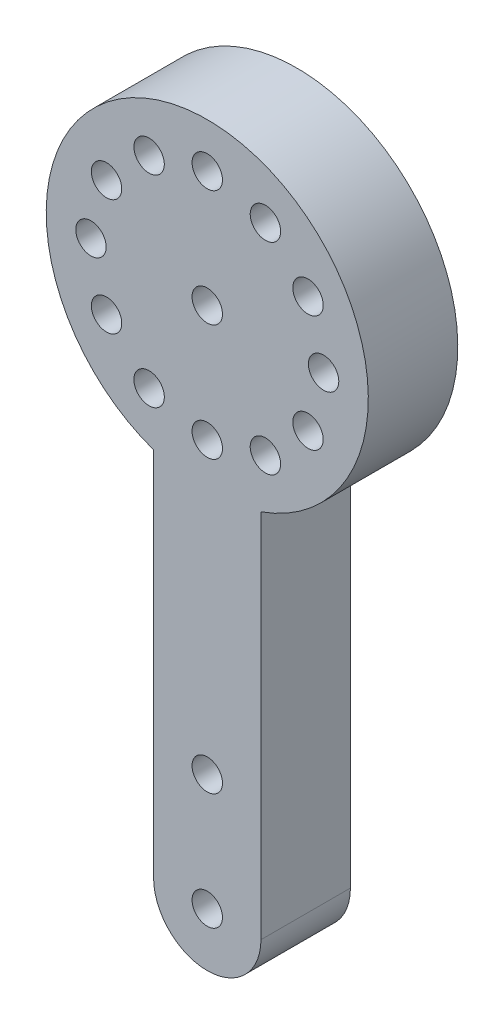
ISO-10303-21;
HEADER;
FILE_DESCRIPTION(('STEP AP214'),'2;1');
FILE_NAME('part.step','',(''),(''),'','','');
FILE_SCHEMA(('AUTOMOTIVE_DESIGN { 1 0 10303 214 1 1 1 1 }'));
ENDSEC;
DATA;
#1=APPLICATION_CONTEXT('core data for automotive mechanical design processes');
#2=APPLICATION_PROTOCOL_DEFINITION('international standard','automotive_design',2000,#1);
#3=PRODUCT_CONTEXT('',#1,'mechanical');
#4=PRODUCT('Part','Part','',(#3));
#5=PRODUCT_RELATED_PRODUCT_CATEGORY('part','',(#4));
#6=PRODUCT_DEFINITION_FORMATION('','',#4);
#7=PRODUCT_DEFINITION_CONTEXT('part definition',#1,'design');
#8=PRODUCT_DEFINITION('design','',#6,#7);
#9=PRODUCT_DEFINITION_SHAPE('','',#8);
#10=(LENGTH_UNIT() NAMED_UNIT(*) SI_UNIT(.MILLI.,.METRE.));
#11=(NAMED_UNIT(*) PLANE_ANGLE_UNIT() SI_UNIT($,.RADIAN.));
#12=(NAMED_UNIT(*) SI_UNIT($,.STERADIAN.) SOLID_ANGLE_UNIT());
#13=UNCERTAINTY_MEASURE_WITH_UNIT(LENGTH_MEASURE(1.E-05),#10,'distance_accuracy_value','');
#14=(GEOMETRIC_REPRESENTATION_CONTEXT(3) GLOBAL_UNCERTAINTY_ASSIGNED_CONTEXT((#13)) GLOBAL_UNIT_ASSIGNED_CONTEXT((#10,
#11,#12)) REPRESENTATION_CONTEXT('',''));
#15=CARTESIAN_POINT('',(0.,0.,0.));
#16=DIRECTION('',(0.,0.,1.));
#17=DIRECTION('',(1.,0.,0.));
#18=AXIS2_PLACEMENT_3D('',#15,#16,#17);
#19=CARTESIAN_POINT('',(0.,0.,5.));
#20=DIRECTION('',(0.,0.,1.));
#21=DIRECTION('',(1.,0.,0.));
#22=AXIS2_PLACEMENT_3D('',#19,#20,#21);
#23=PLANE('',#22);
#24=CARTESIAN_POINT('',(11.2583302491977,51.8878305422792,5.));
#25=DIRECTION('',(0.,0.,1.));
#26=DIRECTION('',(1.,0.,0.));
#27=AXIS2_PLACEMENT_3D('',#24,#25,#26);
#28=CIRCLE('',#27,1.7);
#29=CARTESIAN_POINT('',(12.9583302491977,51.8878305422792,5.));
#30=VERTEX_POINT('',#29);
#31=EDGE_CURVE('E193',#30,#30,#28,.T.);
#32=ORIENTED_EDGE('',*,*,#31,.F.);
#33=EDGE_LOOP('',(#32));
#34=FACE_BOUND('',#33,.T.);
#35=CARTESIAN_POINT('',(11.2583302491977,64.8878305422792,5.));
#36=DIRECTION('',(0.,0.,1.));
#37=DIRECTION('',(1.,0.,0.));
#38=AXIS2_PLACEMENT_3D('',#35,#36,#37);
#39=CIRCLE('',#38,1.70000000000001);
#40=CARTESIAN_POINT('',(12.9583302491977,64.8878305422792,5.));
#41=VERTEX_POINT('',#40);
#42=EDGE_CURVE('E181',#41,#41,#39,.T.);
#43=ORIENTED_EDGE('',*,*,#42,.F.);
#44=EDGE_LOOP('',(#43));
#45=FACE_BOUND('',#44,.T.);
#46=CARTESIAN_POINT('',(0.,71.3878305422792,5.));
#47=DIRECTION('',(0.,0.,1.));
#48=DIRECTION('',(1.,0.,0.));
#49=AXIS2_PLACEMENT_3D('',#46,#47,#48);
#50=CIRCLE('',#49,1.70000000000001);
#51=CARTESIAN_POINT('',(1.70000000000001,71.3878305422792,5.));
#52=VERTEX_POINT('',#51);
#53=EDGE_CURVE('E169',#52,#52,#50,.T.);
#54=ORIENTED_EDGE('',*,*,#53,.F.);
#55=EDGE_LOOP('',(#54));
#56=FACE_BOUND('',#55,.T.);
#57=CARTESIAN_POINT('',(-11.2583302491977,64.8878305422792,5.));
#58=DIRECTION('',(0.,0.,1.));
#59=DIRECTION('',(1.,0.,0.));
#60=AXIS2_PLACEMENT_3D('',#57,#58,#59);
#61=CIRCLE('',#60,1.70000000000001);
#62=CARTESIAN_POINT('',(-9.55833024919769,64.8878305422792,5.));
#63=VERTEX_POINT('',#62);
#64=EDGE_CURVE('E157',#63,#63,#61,.T.);
#65=ORIENTED_EDGE('',*,*,#64,.F.);
#66=EDGE_LOOP('',(#65));
#67=FACE_BOUND('',#66,.T.);
#68=CARTESIAN_POINT('',(-11.2583302491977,51.8878305422792,5.));
#69=DIRECTION('',(0.,0.,1.));
#70=DIRECTION('',(1.,0.,0.));
#71=AXIS2_PLACEMENT_3D('',#68,#69,#70);
#72=CIRCLE('',#71,1.7);
#73=CARTESIAN_POINT('',(-9.55833024919769,51.8878305422792,5.));
#74=VERTEX_POINT('',#73);
#75=EDGE_CURVE('E145',#74,#74,#72,.T.);
#76=ORIENTED_EDGE('',*,*,#75,.F.);
#77=EDGE_LOOP('',(#76));
#78=FACE_BOUND('',#77,.T.);
#79=CARTESIAN_POINT('',(0.,45.3878305422792,5.));
#80=DIRECTION('',(0.,0.,1.));
#81=DIRECTION('',(1.,0.,0.));
#82=AXIS2_PLACEMENT_3D('',#79,#80,#81);
#83=CIRCLE('',#82,1.7);
#84=CARTESIAN_POINT('',(1.7,45.3878305422792,5.));
#85=VERTEX_POINT('',#84);
#86=EDGE_CURVE('E133',#85,#85,#83,.T.);
#87=ORIENTED_EDGE('',*,*,#86,.F.);
#88=EDGE_LOOP('',(#87));
#89=FACE_BOUND('',#88,.T.);
#90=CARTESIAN_POINT('',(0.,0.,5.));
#91=DIRECTION('',(0.,0.,1.));
#92=DIRECTION('',(1.,0.,0.));
#93=AXIS2_PLACEMENT_3D('',#90,#91,#92);
#94=CIRCLE('',#93,1.7);
#95=CARTESIAN_POINT('',(1.7,0.,5.));
#96=VERTEX_POINT('',#95);
#97=EDGE_CURVE('E121',#96,#96,#94,.T.);
#98=ORIENTED_EDGE('',*,*,#97,.F.);
#99=EDGE_LOOP('',(#98));
#100=FACE_BOUND('',#99,.T.);
#101=CARTESIAN_POINT('',(0.,0.,5.));
#102=DIRECTION('',(0.,0.,1.));
#103=DIRECTION('',(1.,0.,0.));
#104=AXIS2_PLACEMENT_3D('',#101,#102,#103);
#105=CIRCLE('',#104,6.0000000000034);
#106=CARTESIAN_POINT('',(-5.99999999999651,9.244999036111E-06,5.));
#107=VERTEX_POINT('',#106);
#108=CARTESIAN_POINT('',(5.99999999999159,-1.17905613372308E-05,5.));
#109=VERTEX_POINT('',#108);
#110=EDGE_CURVE('E91',#107,#109,#105,.T.);
#111=ORIENTED_EDGE('',*,*,#110,.T.);
#112=DIRECTION('',(7.18269886068625E-07,0.999999999999742,0.));
#113=VECTOR('',#112,1.);
#114=CARTESIAN_POINT('',(5.99999999999159,-1.17905613372308E-05,5.));
#115=LINE('',#114,#113);
#116=CARTESIAN_POINT('',(6.00002974878383,41.4172783116145,5.));
#117=VERTEX_POINT('',#116);
#118=EDGE_CURVE('E86',#109,#117,#115,.T.);
#119=ORIENTED_EDGE('',*,*,#118,.T.);
#120=CARTESIAN_POINT('',(0.,58.3878305422792,5.));
#121=DIRECTION('',(0.,0.,1.));
#122=DIRECTION('',(1.,0.,0.));
#123=AXIS2_PLACEMENT_3D('',#120,#121,#122);
#124=CIRCLE('',#123,18.0000000000002);
#125=CARTESIAN_POINT('',(-5.99997025123423,41.4172572760541,5.));
#126=VERTEX_POINT('',#125);
#127=EDGE_CURVE('E89',#117,#126,#124,.T.);
#128=ORIENTED_EDGE('',*,*,#127,.T.);
#129=DIRECTION('',(-7.18269892172502E-07,-0.999999999999742,0.));
#130=VECTOR('',#129,1.);
#131=CARTESIAN_POINT('',(-5.99999999999651,9.244999036111E-06,5.));
#132=LINE('',#131,#130);
#133=EDGE_CURVE('E56',#126,#107,#132,.T.);
#134=ORIENTED_EDGE('',*,*,#133,.T.);
#135=EDGE_LOOP('',(#111,#119,#128,#134));
#136=FACE_BOUND('',#135,.T.);
#137=CARTESIAN_POINT('',(0.,58.3878305422792,5.));
#138=DIRECTION('',(0.,0.,1.));
#139=DIRECTION('',(1.,0.,0.));
#140=AXIS2_PLACEMENT_3D('',#137,#138,#139);
#141=CIRCLE('',#140,1.7);
#142=CARTESIAN_POINT('',(1.7,58.3878305422792,5.));
#143=VERTEX_POINT('',#142);
#144=EDGE_CURVE('E106',#143,#143,#141,.T.);
#145=ORIENTED_EDGE('',*,*,#144,.F.);
#146=EDGE_LOOP('',(#145));
#147=FACE_BOUND('',#146,.T.);
#148=CARTESIAN_POINT('',(0.,13.,5.));
#149=DIRECTION('',(0.,0.,1.));
#150=DIRECTION('',(1.,0.,0.));
#151=AXIS2_PLACEMENT_3D('',#148,#149,#150);
#152=CIRCLE('',#151,1.7);
#153=CARTESIAN_POINT('',(1.7,13.,5.));
#154=VERTEX_POINT('',#153);
#155=EDGE_CURVE('E127',#154,#154,#152,.T.);
#156=ORIENTED_EDGE('',*,*,#155,.F.);
#157=EDGE_LOOP('',(#156));
#158=FACE_BOUND('',#157,.T.);
#159=CARTESIAN_POINT('',(-6.5,47.1295002930815,5.));
#160=DIRECTION('',(0.,0.,1.));
#161=DIRECTION('',(1.,0.,0.));
#162=AXIS2_PLACEMENT_3D('',#159,#160,#161);
#163=CIRCLE('',#162,1.7);
#164=CARTESIAN_POINT('',(-4.8,47.1295002930815,5.));
#165=VERTEX_POINT('',#164);
#166=EDGE_CURVE('E139',#165,#165,#163,.T.);
#167=ORIENTED_EDGE('',*,*,#166,.F.);
#168=EDGE_LOOP('',(#167));
#169=FACE_BOUND('',#168,.T.);
#170=CARTESIAN_POINT('',(-13.,58.3878305422792,5.));
#171=DIRECTION('',(0.,0.,1.));
#172=DIRECTION('',(1.,0.,0.));
#173=AXIS2_PLACEMENT_3D('',#170,#171,#172);
#174=CIRCLE('',#173,1.7);
#175=CARTESIAN_POINT('',(-11.3,58.3878305422792,5.));
#176=VERTEX_POINT('',#175);
#177=EDGE_CURVE('E151',#176,#176,#174,.T.);
#178=ORIENTED_EDGE('',*,*,#177,.F.);
#179=EDGE_LOOP('',(#178));
#180=FACE_BOUND('',#179,.T.);
#181=CARTESIAN_POINT('',(-6.50000000000001,69.6461607914769,5.));
#182=DIRECTION('',(0.,0.,1.));
#183=DIRECTION('',(1.,0.,0.));
#184=AXIS2_PLACEMENT_3D('',#181,#182,#183);
#185=CIRCLE('',#184,1.70000000000001);
#186=CARTESIAN_POINT('',(-4.79999999999999,69.6461607914769,5.));
#187=VERTEX_POINT('',#186);
#188=EDGE_CURVE('E163',#187,#187,#185,.T.);
#189=ORIENTED_EDGE('',*,*,#188,.F.);
#190=EDGE_LOOP('',(#189));
#191=FACE_BOUND('',#190,.T.);
#192=CARTESIAN_POINT('',(6.5,69.6461607914769,5.));
#193=DIRECTION('',(0.,0.,1.));
#194=DIRECTION('',(1.,0.,0.));
#195=AXIS2_PLACEMENT_3D('',#192,#193,#194);
#196=CIRCLE('',#195,1.70000000000001);
#197=CARTESIAN_POINT('',(8.20000000000001,69.6461607914769,5.));
#198=VERTEX_POINT('',#197);
#199=EDGE_CURVE('E175',#198,#198,#196,.T.);
#200=ORIENTED_EDGE('',*,*,#199,.F.);
#201=EDGE_LOOP('',(#200));
#202=FACE_BOUND('',#201,.T.);
#203=CARTESIAN_POINT('',(13.,58.3878305422792,5.));
#204=DIRECTION('',(0.,0.,1.));
#205=DIRECTION('',(1.,0.,0.));
#206=AXIS2_PLACEMENT_3D('',#203,#204,#205);
#207=CIRCLE('',#206,1.7);
#208=CARTESIAN_POINT('',(14.7,58.3878305422792,5.));
#209=VERTEX_POINT('',#208);
#210=EDGE_CURVE('E187',#209,#209,#207,.T.);
#211=ORIENTED_EDGE('',*,*,#210,.F.);
#212=EDGE_LOOP('',(#211));
#213=FACE_BOUND('',#212,.T.);
#214=CARTESIAN_POINT('',(6.49999999999999,47.1295002930815,5.));
#215=DIRECTION('',(0.,0.,1.));
#216=DIRECTION('',(1.,0.,0.));
#217=AXIS2_PLACEMENT_3D('',#214,#215,#216);
#218=CIRCLE('',#217,1.7);
#219=CARTESIAN_POINT('',(8.19999999999999,47.1295002930815,5.));
#220=VERTEX_POINT('',#219);
#221=EDGE_CURVE('E199',#220,#220,#218,.T.);
#222=ORIENTED_EDGE('',*,*,#221,.F.);
#223=EDGE_LOOP('',(#222));
#224=FACE_BOUND('',#223,.T.);
#225=ADVANCED_FACE('F39',(#34,#45,#56,#67,#78,#89,#100,#136,#147,#158,#169,#180,#191,#202,#213,
#224),#23,.T.);
#226=CARTESIAN_POINT('',(0.,0.,-5.));
#227=DIRECTION('',(0.,0.,1.));
#228=DIRECTION('',(1.,0.,0.));
#229=AXIS2_PLACEMENT_3D('',#226,#227,#228);
#230=PLANE('',#229);
#231=CARTESIAN_POINT('',(0.,0.,-5.));
#232=DIRECTION('',(0.,0.,1.));
#233=DIRECTION('',(1.,0.,0.));
#234=AXIS2_PLACEMENT_3D('',#231,#232,#233);
#235=CIRCLE('',#234,6.0000000000034);
#236=CARTESIAN_POINT('',(-5.99999999999651,9.244999036111E-06,-5.));
#237=VERTEX_POINT('',#236);
#238=CARTESIAN_POINT('',(5.99999999999159,-1.17905613372308E-05,-5.));
#239=VERTEX_POINT('',#238);
#240=EDGE_CURVE('E103',#237,#239,#235,.T.);
#241=ORIENTED_EDGE('',*,*,#240,.F.);
#242=DIRECTION('',(-7.18269892172502E-07,-0.999999999999742,0.));
#243=VECTOR('',#242,1.);
#244=CARTESIAN_POINT('',(-5.99999999999651,9.244999036111E-06,-5.));
#245=LINE('',#244,#243);
#246=CARTESIAN_POINT('',(-5.99997025123423,41.4172572760541,-5.));
#247=VERTEX_POINT('',#246);
#248=EDGE_CURVE('E79',#247,#237,#245,.T.);
#249=ORIENTED_EDGE('',*,*,#248,.F.);
#250=CARTESIAN_POINT('',(0.,58.3878305422792,-5.));
#251=DIRECTION('',(0.,0.,1.));
#252=DIRECTION('',(1.,0.,0.));
#253=AXIS2_PLACEMENT_3D('',#250,#251,#252);
#254=CIRCLE('',#253,18.0000000000002);
#255=CARTESIAN_POINT('',(6.00002974878383,41.4172783116145,-5.));
#256=VERTEX_POINT('',#255);
#257=EDGE_CURVE('E73',#256,#247,#254,.T.);
#258=ORIENTED_EDGE('',*,*,#257,.F.);
#259=DIRECTION('',(7.18269886068625E-07,0.999999999999742,0.));
#260=VECTOR('',#259,1.);
#261=CARTESIAN_POINT('',(5.99999999999159,-1.17905613372308E-05,-5.));
#262=LINE('',#261,#260);
#263=EDGE_CURVE('E95',#239,#256,#262,.T.);
#264=ORIENTED_EDGE('',*,*,#263,.F.);
#265=EDGE_LOOP('',(#241,#249,#258,#264));
#266=FACE_BOUND('',#265,.T.);
#267=CARTESIAN_POINT('',(0.,58.3878305422792,-5.));
#268=DIRECTION('',(0.,0.,1.));
#269=DIRECTION('',(1.,0.,0.));
#270=AXIS2_PLACEMENT_3D('',#267,#268,#269);
#271=CIRCLE('',#270,1.7);
#272=CARTESIAN_POINT('',(1.7,58.3878305422792,-5.));
#273=VERTEX_POINT('',#272);
#274=EDGE_CURVE('E118',#273,#273,#271,.T.);
#275=ORIENTED_EDGE('',*,*,#274,.T.);
#276=EDGE_LOOP('',(#275));
#277=FACE_BOUND('',#276,.T.);
#278=CARTESIAN_POINT('',(0.,0.,-5.));
#279=DIRECTION('',(0.,0.,1.));
#280=DIRECTION('',(1.,0.,0.));
#281=AXIS2_PLACEMENT_3D('',#278,#279,#280);
#282=CIRCLE('',#281,1.7);
#283=CARTESIAN_POINT('',(1.7,0.,-5.));
#284=VERTEX_POINT('',#283);
#285=EDGE_CURVE('E124',#284,#284,#282,.T.);
#286=ORIENTED_EDGE('',*,*,#285,.T.);
#287=EDGE_LOOP('',(#286));
#288=FACE_BOUND('',#287,.T.);
#289=CARTESIAN_POINT('',(0.,13.,-5.));
#290=DIRECTION('',(0.,0.,1.));
#291=DIRECTION('',(1.,0.,0.));
#292=AXIS2_PLACEMENT_3D('',#289,#290,#291);
#293=CIRCLE('',#292,1.7);
#294=CARTESIAN_POINT('',(1.7,13.,-5.));
#295=VERTEX_POINT('',#294);
#296=EDGE_CURVE('E130',#295,#295,#293,.T.);
#297=ORIENTED_EDGE('',*,*,#296,.T.);
#298=EDGE_LOOP('',(#297));
#299=FACE_BOUND('',#298,.T.);
#300=CARTESIAN_POINT('',(0.,45.3878305422792,-5.));
#301=DIRECTION('',(0.,0.,1.));
#302=DIRECTION('',(1.,0.,0.));
#303=AXIS2_PLACEMENT_3D('',#300,#301,#302);
#304=CIRCLE('',#303,1.7);
#305=CARTESIAN_POINT('',(1.7,45.3878305422792,-5.));
#306=VERTEX_POINT('',#305);
#307=EDGE_CURVE('E136',#306,#306,#304,.T.);
#308=ORIENTED_EDGE('',*,*,#307,.T.);
#309=EDGE_LOOP('',(#308));
#310=FACE_BOUND('',#309,.T.);
#311=CARTESIAN_POINT('',(-6.5,47.1295002930815,-5.));
#312=DIRECTION('',(0.,0.,1.));
#313=DIRECTION('',(1.,0.,0.));
#314=AXIS2_PLACEMENT_3D('',#311,#312,#313);
#315=CIRCLE('',#314,1.7);
#316=CARTESIAN_POINT('',(-4.8,47.1295002930815,-5.));
#317=VERTEX_POINT('',#316);
#318=EDGE_CURVE('E142',#317,#317,#315,.T.);
#319=ORIENTED_EDGE('',*,*,#318,.T.);
#320=EDGE_LOOP('',(#319));
#321=FACE_BOUND('',#320,.T.);
#322=CARTESIAN_POINT('',(-11.2583302491977,51.8878305422792,-5.));
#323=DIRECTION('',(0.,0.,1.));
#324=DIRECTION('',(1.,0.,0.));
#325=AXIS2_PLACEMENT_3D('',#322,#323,#324);
#326=CIRCLE('',#325,1.7);
#327=CARTESIAN_POINT('',(-9.55833024919769,51.8878305422792,-5.));
#328=VERTEX_POINT('',#327);
#329=EDGE_CURVE('E148',#328,#328,#326,.T.);
#330=ORIENTED_EDGE('',*,*,#329,.T.);
#331=EDGE_LOOP('',(#330));
#332=FACE_BOUND('',#331,.T.);
#333=CARTESIAN_POINT('',(-13.,58.3878305422792,-5.));
#334=DIRECTION('',(0.,0.,1.));
#335=DIRECTION('',(1.,0.,0.));
#336=AXIS2_PLACEMENT_3D('',#333,#334,#335);
#337=CIRCLE('',#336,1.7);
#338=CARTESIAN_POINT('',(-11.3,58.3878305422792,-5.));
#339=VERTEX_POINT('',#338);
#340=EDGE_CURVE('E154',#339,#339,#337,.T.);
#341=ORIENTED_EDGE('',*,*,#340,.T.);
#342=EDGE_LOOP('',(#341));
#343=FACE_BOUND('',#342,.T.);
#344=CARTESIAN_POINT('',(-11.2583302491977,64.8878305422792,-5.));
#345=DIRECTION('',(0.,0.,1.));
#346=DIRECTION('',(1.,0.,0.));
#347=AXIS2_PLACEMENT_3D('',#344,#345,#346);
#348=CIRCLE('',#347,1.70000000000001);
#349=CARTESIAN_POINT('',(-9.55833024919769,64.8878305422792,-5.));
#350=VERTEX_POINT('',#349);
#351=EDGE_CURVE('E160',#350,#350,#348,.T.);
#352=ORIENTED_EDGE('',*,*,#351,.T.);
#353=EDGE_LOOP('',(#352));
#354=FACE_BOUND('',#353,.T.);
#355=CARTESIAN_POINT('',(-6.50000000000001,69.6461607914769,-5.));
#356=DIRECTION('',(0.,0.,1.));
#357=DIRECTION('',(1.,0.,0.));
#358=AXIS2_PLACEMENT_3D('',#355,#356,#357);
#359=CIRCLE('',#358,1.70000000000001);
#360=CARTESIAN_POINT('',(-4.79999999999999,69.6461607914769,-5.));
#361=VERTEX_POINT('',#360);
#362=EDGE_CURVE('E166',#361,#361,#359,.T.);
#363=ORIENTED_EDGE('',*,*,#362,.T.);
#364=EDGE_LOOP('',(#363));
#365=FACE_BOUND('',#364,.T.);
#366=CARTESIAN_POINT('',(0.,71.3878305422792,-5.));
#367=DIRECTION('',(0.,0.,1.));
#368=DIRECTION('',(1.,0.,0.));
#369=AXIS2_PLACEMENT_3D('',#366,#367,#368);
#370=CIRCLE('',#369,1.70000000000001);
#371=CARTESIAN_POINT('',(1.70000000000001,71.3878305422792,-5.));
#372=VERTEX_POINT('',#371);
#373=EDGE_CURVE('E172',#372,#372,#370,.T.);
#374=ORIENTED_EDGE('',*,*,#373,.T.);
#375=EDGE_LOOP('',(#374));
#376=FACE_BOUND('',#375,.T.);
#377=CARTESIAN_POINT('',(6.5,69.6461607914769,-5.));
#378=DIRECTION('',(0.,0.,1.));
#379=DIRECTION('',(1.,0.,0.));
#380=AXIS2_PLACEMENT_3D('',#377,#378,#379);
#381=CIRCLE('',#380,1.70000000000001);
#382=CARTESIAN_POINT('',(8.20000000000001,69.6461607914769,-5.));
#383=VERTEX_POINT('',#382);
#384=EDGE_CURVE('E178',#383,#383,#381,.T.);
#385=ORIENTED_EDGE('',*,*,#384,.T.);
#386=EDGE_LOOP('',(#385));
#387=FACE_BOUND('',#386,.T.);
#388=CARTESIAN_POINT('',(11.2583302491977,64.8878305422792,-5.));
#389=DIRECTION('',(0.,0.,1.));
#390=DIRECTION('',(1.,0.,0.));
#391=AXIS2_PLACEMENT_3D('',#388,#389,#390);
#392=CIRCLE('',#391,1.70000000000001);
#393=CARTESIAN_POINT('',(12.9583302491977,64.8878305422792,-5.));
#394=VERTEX_POINT('',#393);
#395=EDGE_CURVE('E184',#394,#394,#392,.T.);
#396=ORIENTED_EDGE('',*,*,#395,.T.);
#397=EDGE_LOOP('',(#396));
#398=FACE_BOUND('',#397,.T.);
#399=CARTESIAN_POINT('',(13.,58.3878305422792,-5.));
#400=DIRECTION('',(0.,0.,1.));
#401=DIRECTION('',(1.,0.,0.));
#402=AXIS2_PLACEMENT_3D('',#399,#400,#401);
#403=CIRCLE('',#402,1.7);
#404=CARTESIAN_POINT('',(14.7,58.3878305422792,-5.));
#405=VERTEX_POINT('',#404);
#406=EDGE_CURVE('E190',#405,#405,#403,.T.);
#407=ORIENTED_EDGE('',*,*,#406,.T.);
#408=EDGE_LOOP('',(#407));
#409=FACE_BOUND('',#408,.T.);
#410=CARTESIAN_POINT('',(11.2583302491977,51.8878305422792,-5.));
#411=DIRECTION('',(0.,0.,1.));
#412=DIRECTION('',(1.,0.,0.));
#413=AXIS2_PLACEMENT_3D('',#410,#411,#412);
#414=CIRCLE('',#413,1.7);
#415=CARTESIAN_POINT('',(12.9583302491977,51.8878305422792,-5.));
#416=VERTEX_POINT('',#415);
#417=EDGE_CURVE('E196',#416,#416,#414,.T.);
#418=ORIENTED_EDGE('',*,*,#417,.T.);
#419=EDGE_LOOP('',(#418));
#420=FACE_BOUND('',#419,.T.);
#421=CARTESIAN_POINT('',(6.49999999999999,47.1295002930815,-5.));
#422=DIRECTION('',(0.,0.,1.));
#423=DIRECTION('',(1.,0.,0.));
#424=AXIS2_PLACEMENT_3D('',#421,#422,#423);
#425=CIRCLE('',#424,1.7);
#426=CARTESIAN_POINT('',(8.19999999999999,47.1295002930815,-5.));
#427=VERTEX_POINT('',#426);
#428=EDGE_CURVE('E202',#427,#427,#425,.T.);
#429=ORIENTED_EDGE('',*,*,#428,.T.);
#430=EDGE_LOOP('',(#429));
#431=FACE_BOUND('',#430,.T.);
#432=ADVANCED_FACE('F114',(#266,#277,#288,#299,#310,#321,#332,#343,#354,#365,#376,#387,#398,
#409,#420,#431),#230,.F.);
#433=CARTESIAN_POINT('',(0.,0.,5.));
#434=DIRECTION('',(0.,0.,-1.));
#435=DIRECTION('',(-1.,0.,0.));
#436=AXIS2_PLACEMENT_3D('',#433,#434,#435);
#437=CYLINDRICAL_SURFACE('',#436,6.0000000000034);
#438=ORIENTED_EDGE('',*,*,#240,.T.);
#439=DIRECTION('',(0.,0.,-1.));
#440=VECTOR('',#439,1.);
#441=CARTESIAN_POINT('',(5.99999999999159,-1.17905613372308E-05,5.));
#442=LINE('',#441,#440);
#443=EDGE_CURVE('E11',#109,#239,#442,.T.);
#444=ORIENTED_EDGE('',*,*,#443,.F.);
#445=ORIENTED_EDGE('',*,*,#110,.F.);
#446=DIRECTION('',(0.,0.,-1.));
#447=VECTOR('',#446,1.);
#448=CARTESIAN_POINT('',(-5.99999999999651,9.244999036111E-06,5.));
#449=LINE('',#448,#447);
#450=EDGE_CURVE('E99',#107,#237,#449,.T.);
#451=ORIENTED_EDGE('',*,*,#450,.T.);
#452=EDGE_LOOP('',(#438,#444,#445,#451));
#453=FACE_BOUND('',#452,.T.);
#454=ADVANCED_FACE('F41',(#453),#437,.T.);
#455=CARTESIAN_POINT('',(5.99999999999159,-1.17905613372308E-05,5.));
#456=DIRECTION('',(-0.999999999999742,7.18269886068625E-07,0.));
#457=DIRECTION('',(-7.18269886068625E-07,-0.999999999999742,0.));
#458=AXIS2_PLACEMENT_3D('',#455,#456,#457);
#459=PLANE('',#458);
#460=ORIENTED_EDGE('',*,*,#263,.T.);
#461=DIRECTION('',(0.,0.,-1.));
#462=VECTOR('',#461,1.);
#463=CARTESIAN_POINT('',(6.00002974878383,41.4172783116145,5.));
#464=LINE('',#463,#462);
#465=EDGE_CURVE('E48',#117,#256,#464,.T.);
#466=ORIENTED_EDGE('',*,*,#465,.F.);
#467=ORIENTED_EDGE('',*,*,#118,.F.);
#468=ORIENTED_EDGE('',*,*,#443,.T.);
#469=EDGE_LOOP('',(#460,#466,#467,#468));
#470=FACE_BOUND('',#469,.T.);
#471=ADVANCED_FACE('F94',(#470),#459,.F.);
#472=CARTESIAN_POINT('',(0.,58.3878305422792,5.));
#473=DIRECTION('',(0.,0.,-1.));
#474=DIRECTION('',(-1.,0.,0.));
#475=AXIS2_PLACEMENT_3D('',#472,#473,#474);
#476=CYLINDRICAL_SURFACE('',#475,18.0000000000002);
#477=ORIENTED_EDGE('',*,*,#257,.T.);
#478=DIRECTION('',(0.,0.,-1.));
#479=VECTOR('',#478,1.);
#480=CARTESIAN_POINT('',(-5.99997025123423,41.4172572760541,5.));
#481=LINE('',#480,#479);
#482=EDGE_CURVE('E96',#126,#247,#481,.T.);
#483=ORIENTED_EDGE('',*,*,#482,.F.);
#484=ORIENTED_EDGE('',*,*,#127,.F.);
#485=ORIENTED_EDGE('',*,*,#465,.T.);
#486=EDGE_LOOP('',(#477,#483,#484,#485));
#487=FACE_BOUND('',#486,.T.);
#488=ADVANCED_FACE('F97',(#487),#476,.T.);
#489=CARTESIAN_POINT('',(-5.99999999999651,9.244999036111E-06,5.));
#490=DIRECTION('',(0.999999999999742,-7.18269892172502E-07,0.));
#491=DIRECTION('',(7.18269892172502E-07,0.999999999999742,0.));
#492=AXIS2_PLACEMENT_3D('',#489,#490,#491);
#493=PLANE('',#492);
#494=ORIENTED_EDGE('',*,*,#248,.T.);
#495=ORIENTED_EDGE('',*,*,#450,.F.);
#496=ORIENTED_EDGE('',*,*,#133,.F.);
#497=ORIENTED_EDGE('',*,*,#482,.T.);
#498=EDGE_LOOP('',(#494,#495,#496,#497));
#499=FACE_BOUND('',#498,.T.);
#500=ADVANCED_FACE('F111',(#499),#493,.F.);
#501=CARTESIAN_POINT('',(0.,58.3878305422792,5.));
#502=DIRECTION('',(0.,0.,-1.));
#503=DIRECTION('',(-1.,0.,0.));
#504=AXIS2_PLACEMENT_3D('',#501,#502,#503);
#505=CYLINDRICAL_SURFACE('',#504,1.7);
#506=ORIENTED_EDGE('',*,*,#144,.T.);
#507=EDGE_LOOP('',(#506));
#508=FACE_BOUND('',#507,.T.);
#509=ORIENTED_EDGE('',*,*,#274,.F.);
#510=EDGE_LOOP('',(#509));
#511=FACE_BOUND('',#510,.T.);
#512=ADVANCED_FACE('F221',(#508,#511),#505,.F.);
#513=CARTESIAN_POINT('',(0.,0.,5.));
#514=DIRECTION('',(0.,0.,-1.));
#515=DIRECTION('',(-1.,0.,0.));
#516=AXIS2_PLACEMENT_3D('',#513,#514,#515);
#517=CYLINDRICAL_SURFACE('',#516,1.7);
#518=ORIENTED_EDGE('',*,*,#97,.T.);
#519=EDGE_LOOP('',(#518));
#520=FACE_BOUND('',#519,.T.);
#521=ORIENTED_EDGE('',*,*,#285,.F.);
#522=EDGE_LOOP('',(#521));
#523=FACE_BOUND('',#522,.T.);
#524=ADVANCED_FACE('F272',(#520,#523),#517,.F.);
#525=CARTESIAN_POINT('',(0.,13.,5.));
#526=DIRECTION('',(0.,0.,-1.));
#527=DIRECTION('',(-1.,0.,0.));
#528=AXIS2_PLACEMENT_3D('',#525,#526,#527);
#529=CYLINDRICAL_SURFACE('',#528,1.7);
#530=ORIENTED_EDGE('',*,*,#155,.T.);
#531=EDGE_LOOP('',(#530));
#532=FACE_BOUND('',#531,.T.);
#533=ORIENTED_EDGE('',*,*,#296,.F.);
#534=EDGE_LOOP('',(#533));
#535=FACE_BOUND('',#534,.T.);
#536=ADVANCED_FACE('F280',(#532,#535),#529,.F.);
#537=CARTESIAN_POINT('',(0.,45.3878305422792,5.));
#538=DIRECTION('',(0.,0.,-1.));
#539=DIRECTION('',(-1.,0.,0.));
#540=AXIS2_PLACEMENT_3D('',#537,#538,#539);
#541=CYLINDRICAL_SURFACE('',#540,1.7);
#542=ORIENTED_EDGE('',*,*,#86,.T.);
#543=EDGE_LOOP('',(#542));
#544=FACE_BOUND('',#543,.T.);
#545=ORIENTED_EDGE('',*,*,#307,.F.);
#546=EDGE_LOOP('',(#545));
#547=FACE_BOUND('',#546,.T.);
#548=ADVANCED_FACE('F288',(#544,#547),#541,.F.);
#549=CARTESIAN_POINT('',(-6.5,47.1295002930815,5.));
#550=DIRECTION('',(0.,0.,-1.));
#551=DIRECTION('',(-1.,0.,0.));
#552=AXIS2_PLACEMENT_3D('',#549,#550,#551);
#553=CYLINDRICAL_SURFACE('',#552,1.7);
#554=ORIENTED_EDGE('',*,*,#166,.T.);
#555=EDGE_LOOP('',(#554));
#556=FACE_BOUND('',#555,.T.);
#557=ORIENTED_EDGE('',*,*,#318,.F.);
#558=EDGE_LOOP('',(#557));
#559=FACE_BOUND('',#558,.T.);
#560=ADVANCED_FACE('F297',(#556,#559),#553,.F.);
#561=CARTESIAN_POINT('',(-11.2583302491977,51.8878305422792,5.));
#562=DIRECTION('',(0.,0.,-1.));
#563=DIRECTION('',(-1.,0.,0.));
#564=AXIS2_PLACEMENT_3D('',#561,#562,#563);
#565=CYLINDRICAL_SURFACE('',#564,1.7);
#566=ORIENTED_EDGE('',*,*,#75,.T.);
#567=EDGE_LOOP('',(#566));
#568=FACE_BOUND('',#567,.T.);
#569=ORIENTED_EDGE('',*,*,#329,.F.);
#570=EDGE_LOOP('',(#569));
#571=FACE_BOUND('',#570,.T.);
#572=ADVANCED_FACE('F306',(#568,#571),#565,.F.);
#573=CARTESIAN_POINT('',(-13.,58.3878305422792,5.));
#574=DIRECTION('',(0.,0.,-1.));
#575=DIRECTION('',(-1.,0.,0.));
#576=AXIS2_PLACEMENT_3D('',#573,#574,#575);
#577=CYLINDRICAL_SURFACE('',#576,1.7);
#578=ORIENTED_EDGE('',*,*,#177,.T.);
#579=EDGE_LOOP('',(#578));
#580=FACE_BOUND('',#579,.T.);
#581=ORIENTED_EDGE('',*,*,#340,.F.);
#582=EDGE_LOOP('',(#581));
#583=FACE_BOUND('',#582,.T.);
#584=ADVANCED_FACE('F315',(#580,#583),#577,.F.);
#585=CARTESIAN_POINT('',(-11.2583302491977,64.8878305422792,5.));
#586=DIRECTION('',(0.,0.,-1.));
#587=DIRECTION('',(-1.,0.,0.));
#588=AXIS2_PLACEMENT_3D('',#585,#586,#587);
#589=CYLINDRICAL_SURFACE('',#588,1.70000000000001);
#590=ORIENTED_EDGE('',*,*,#64,.T.);
#591=EDGE_LOOP('',(#590));
#592=FACE_BOUND('',#591,.T.);
#593=ORIENTED_EDGE('',*,*,#351,.F.);
#594=EDGE_LOOP('',(#593));
#595=FACE_BOUND('',#594,.T.);
#596=ADVANCED_FACE('F324',(#592,#595),#589,.F.);
#597=CARTESIAN_POINT('',(-6.50000000000001,69.6461607914769,5.));
#598=DIRECTION('',(0.,0.,-1.));
#599=DIRECTION('',(-1.,0.,0.));
#600=AXIS2_PLACEMENT_3D('',#597,#598,#599);
#601=CYLINDRICAL_SURFACE('',#600,1.70000000000001);
#602=ORIENTED_EDGE('',*,*,#188,.T.);
#603=EDGE_LOOP('',(#602));
#604=FACE_BOUND('',#603,.T.);
#605=ORIENTED_EDGE('',*,*,#362,.F.);
#606=EDGE_LOOP('',(#605));
#607=FACE_BOUND('',#606,.T.);
#608=ADVANCED_FACE('F333',(#604,#607),#601,.F.);
#609=CARTESIAN_POINT('',(0.,71.3878305422792,5.));
#610=DIRECTION('',(0.,0.,-1.));
#611=DIRECTION('',(-1.,0.,0.));
#612=AXIS2_PLACEMENT_3D('',#609,#610,#611);
#613=CYLINDRICAL_SURFACE('',#612,1.70000000000001);
#614=ORIENTED_EDGE('',*,*,#53,.T.);
#615=EDGE_LOOP('',(#614));
#616=FACE_BOUND('',#615,.T.);
#617=ORIENTED_EDGE('',*,*,#373,.F.);
#618=EDGE_LOOP('',(#617));
#619=FACE_BOUND('',#618,.T.);
#620=ADVANCED_FACE('F342',(#616,#619),#613,.F.);
#621=CARTESIAN_POINT('',(6.5,69.6461607914769,5.));
#622=DIRECTION('',(0.,0.,-1.));
#623=DIRECTION('',(-1.,0.,0.));
#624=AXIS2_PLACEMENT_3D('',#621,#622,#623);
#625=CYLINDRICAL_SURFACE('',#624,1.70000000000001);
#626=ORIENTED_EDGE('',*,*,#199,.T.);
#627=EDGE_LOOP('',(#626));
#628=FACE_BOUND('',#627,.T.);
#629=ORIENTED_EDGE('',*,*,#384,.F.);
#630=EDGE_LOOP('',(#629));
#631=FACE_BOUND('',#630,.T.);
#632=ADVANCED_FACE('F351',(#628,#631),#625,.F.);
#633=CARTESIAN_POINT('',(11.2583302491977,64.8878305422792,5.));
#634=DIRECTION('',(0.,0.,-1.));
#635=DIRECTION('',(-1.,0.,0.));
#636=AXIS2_PLACEMENT_3D('',#633,#634,#635);
#637=CYLINDRICAL_SURFACE('',#636,1.70000000000001);
#638=ORIENTED_EDGE('',*,*,#42,.T.);
#639=EDGE_LOOP('',(#638));
#640=FACE_BOUND('',#639,.T.);
#641=ORIENTED_EDGE('',*,*,#395,.F.);
#642=EDGE_LOOP('',(#641));
#643=FACE_BOUND('',#642,.T.);
#644=ADVANCED_FACE('F360',(#640,#643),#637,.F.);
#645=CARTESIAN_POINT('',(13.,58.3878305422792,5.));
#646=DIRECTION('',(0.,0.,-1.));
#647=DIRECTION('',(-1.,0.,0.));
#648=AXIS2_PLACEMENT_3D('',#645,#646,#647);
#649=CYLINDRICAL_SURFACE('',#648,1.7);
#650=ORIENTED_EDGE('',*,*,#210,.T.);
#651=EDGE_LOOP('',(#650));
#652=FACE_BOUND('',#651,.T.);
#653=ORIENTED_EDGE('',*,*,#406,.F.);
#654=EDGE_LOOP('',(#653));
#655=FACE_BOUND('',#654,.T.);
#656=ADVANCED_FACE('F369',(#652,#655),#649,.F.);
#657=CARTESIAN_POINT('',(11.2583302491977,51.8878305422792,5.));
#658=DIRECTION('',(0.,0.,-1.));
#659=DIRECTION('',(-1.,0.,0.));
#660=AXIS2_PLACEMENT_3D('',#657,#658,#659);
#661=CYLINDRICAL_SURFACE('',#660,1.7);
#662=ORIENTED_EDGE('',*,*,#31,.T.);
#663=EDGE_LOOP('',(#662));
#664=FACE_BOUND('',#663,.T.);
#665=ORIENTED_EDGE('',*,*,#417,.F.);
#666=EDGE_LOOP('',(#665));
#667=FACE_BOUND('',#666,.T.);
#668=ADVANCED_FACE('F378',(#664,#667),#661,.F.);
#669=CARTESIAN_POINT('',(6.49999999999999,47.1295002930815,5.));
#670=DIRECTION('',(0.,0.,-1.));
#671=DIRECTION('',(-1.,0.,0.));
#672=AXIS2_PLACEMENT_3D('',#669,#670,#671);
#673=CYLINDRICAL_SURFACE('',#672,1.7);
#674=ORIENTED_EDGE('',*,*,#221,.T.);
#675=EDGE_LOOP('',(#674));
#676=FACE_BOUND('',#675,.T.);
#677=ORIENTED_EDGE('',*,*,#428,.F.);
#678=EDGE_LOOP('',(#677));
#679=FACE_BOUND('',#678,.T.);
#680=ADVANCED_FACE('F208',(#676,#679),#673,.F.);
#681=CLOSED_SHELL('',(#225,#432,#454,#471,#488,#500,#512,#524,#536,#548,#560,#572,#584,#596,
#608,#620,#632,#644,#656,#668,#680));
#682=MANIFOLD_SOLID_BREP('B2',#681);
#683=ADVANCED_BREP_SHAPE_REPRESENTATION('',(#18,#682),#14);
#684=SHAPE_DEFINITION_REPRESENTATION(#9,#683);
ENDSEC;
END-ISO-10303-21;
